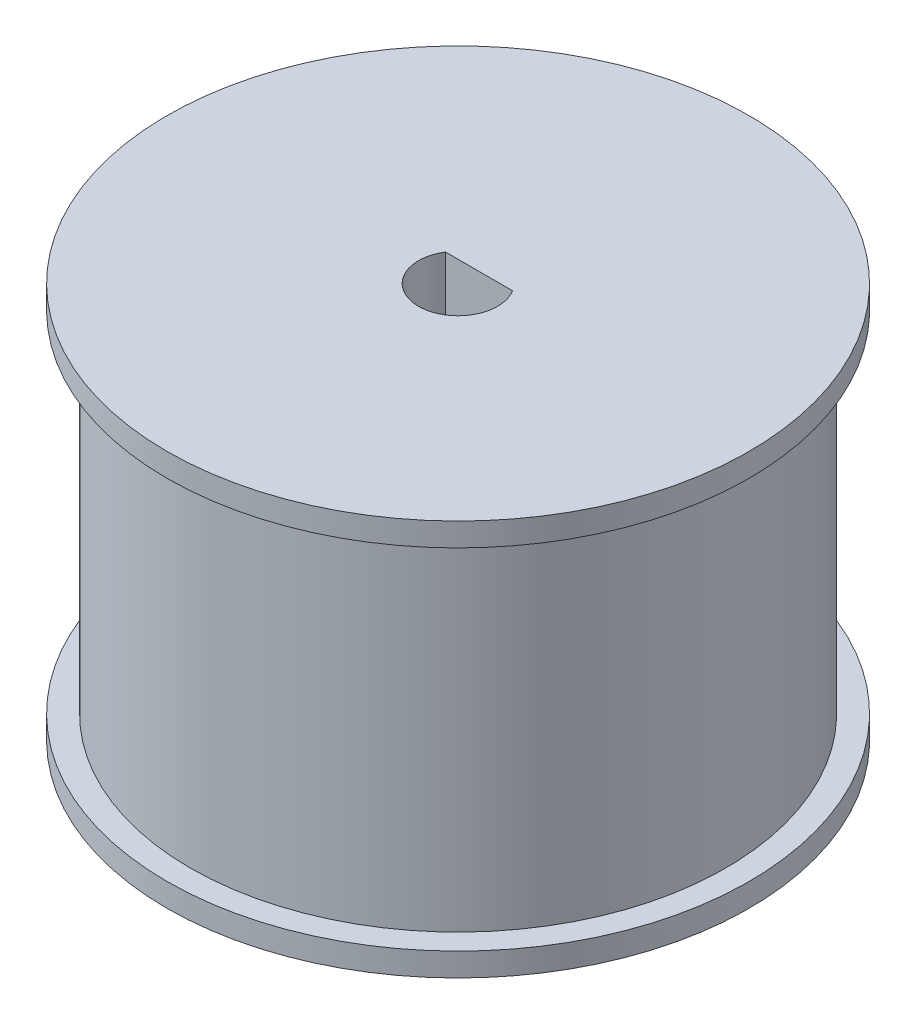
ISO-10303-21;
HEADER;
FILE_DESCRIPTION(('STEP AP214'),'2;1');
FILE_NAME('part.step','',(''),(''),'','','');
FILE_SCHEMA(('AUTOMOTIVE_DESIGN { 1 0 10303 214 1 1 1 1 }'));
ENDSEC;
DATA;
#1=APPLICATION_CONTEXT('core data for automotive mechanical design processes');
#2=APPLICATION_PROTOCOL_DEFINITION('international standard','automotive_design',2000,#1);
#3=PRODUCT_CONTEXT('',#1,'mechanical');
#4=PRODUCT('Part','Part','',(#3));
#5=PRODUCT_RELATED_PRODUCT_CATEGORY('part','',(#4));
#6=PRODUCT_DEFINITION_FORMATION('','',#4);
#7=PRODUCT_DEFINITION_CONTEXT('part definition',#1,'design');
#8=PRODUCT_DEFINITION('design','',#6,#7);
#9=PRODUCT_DEFINITION_SHAPE('','',#8);
#10=(LENGTH_UNIT() NAMED_UNIT(*) SI_UNIT(.MILLI.,.METRE.));
#11=(NAMED_UNIT(*) PLANE_ANGLE_UNIT() SI_UNIT($,.RADIAN.));
#12=(NAMED_UNIT(*) SI_UNIT($,.STERADIAN.) SOLID_ANGLE_UNIT());
#13=UNCERTAINTY_MEASURE_WITH_UNIT(LENGTH_MEASURE(1.E-05),#10,'distance_accuracy_value','');
#14=(GEOMETRIC_REPRESENTATION_CONTEXT(3) GLOBAL_UNCERTAINTY_ASSIGNED_CONTEXT((#13)) GLOBAL_UNIT_ASSIGNED_CONTEXT((#10,
#11,#12)) REPRESENTATION_CONTEXT('',''));
#15=CARTESIAN_POINT('',(0.,0.,0.));
#16=DIRECTION('',(0.,0.,1.));
#17=DIRECTION('',(1.,0.,0.));
#18=AXIS2_PLACEMENT_3D('',#15,#16,#17);
#19=CARTESIAN_POINT('',(0.,13.,-35.));
#20=DIRECTION('',(0.,0.,1.));
#21=DIRECTION('',(1.,0.,0.));
#22=AXIS2_PLACEMENT_3D('',#19,#20,#21);
#23=CYLINDRICAL_SURFACE('',#22,1.5);
#24=CARTESIAN_POINT('',(0.,13.,-3.95028417679426));
#25=DIRECTION('',(0.,0.,-1.));
#26=DIRECTION('',(-1.,0.,0.));
#27=AXIS2_PLACEMENT_3D('',#24,#25,#26);
#28=CIRCLE('',#27,1.5);
#29=CARTESIAN_POINT('',(-1.5,13.,-3.95028417679427));
#30=VERTEX_POINT('',#29);
#31=EDGE_CURVE('E163',#30,#30,#28,.F.);
#32=ORIENTED_EDGE('',*,*,#31,.T.);
#33=EDGE_LOOP('',(#32));
#34=FACE_BOUND('',#33,.T.);
#35=CARTESIAN_POINT('',(0.,13.,-5.));
#36=DIRECTION('',(0.,0.,1.));
#37=DIRECTION('',(1.,0.,0.));
#38=AXIS2_PLACEMENT_3D('',#35,#36,#37);
#39=CIRCLE('',#38,1.5);
#40=CARTESIAN_POINT('',(1.5,13.,-5.));
#41=VERTEX_POINT('',#40);
#42=EDGE_CURVE('E182',#41,#41,#39,.F.);
#43=ORIENTED_EDGE('',*,*,#42,.T.);
#44=EDGE_LOOP('',(#43));
#45=FACE_BOUND('',#44,.T.);
#46=ADVANCED_FACE('F38',(#34,#45),#23,.F.);
#47=CARTESIAN_POINT('',(0.,5.,-0.9));
#48=DIRECTION('',(0.,0.,-1.));
#49=DIRECTION('',(-1.,0.,0.));
#50=AXIS2_PLACEMENT_3D('',#47,#48,#49);
#51=PLANE('',#50);
#52=DIRECTION('',(-1.,0.,0.));
#53=VECTOR('',#52,1.);
#54=CARTESIAN_POINT('',(0.,11.,-0.9));
#55=LINE('',#54,#53);
#56=CARTESIAN_POINT('',(1.4422205101856,11.,-0.9));
#57=VERTEX_POINT('',#56);
#58=CARTESIAN_POINT('',(-1.4422205101856,11.,-0.9));
#59=VERTEX_POINT('',#58);
#60=EDGE_CURVE('E66',#57,#59,#55,.T.);
#61=ORIENTED_EDGE('',*,*,#60,.F.);
#62=DIRECTION('',(0.,1.,0.));
#63=VECTOR('',#62,1.);
#64=CARTESIAN_POINT('',(1.4422205101856,5.,-0.9));
#65=LINE('',#64,#63);
#66=CARTESIAN_POINT('',(1.4422205101856,12.5876894374382,-0.899999999999998));
#67=VERTEX_POINT('',#66);
#68=EDGE_CURVE('E195',#57,#67,#65,.T.);
#69=ORIENTED_EDGE('',*,*,#68,.T.);
#70=CARTESIAN_POINT('',(0.,13.,-0.899999999999998));
#71=DIRECTION('',(0.,0.,-1.));
#72=DIRECTION('',(-1.,0.,0.));
#73=AXIS2_PLACEMENT_3D('',#70,#71,#72);
#74=CIRCLE('',#73,1.5);
#75=CARTESIAN_POINT('',(-1.4422205101856,12.5876894374382,-0.9));
#76=VERTEX_POINT('',#75);
#77=EDGE_CURVE('E183',#67,#76,#74,.T.);
#78=ORIENTED_EDGE('',*,*,#77,.T.);
#79=DIRECTION('',(0.,1.,0.));
#80=VECTOR('',#79,1.);
#81=CARTESIAN_POINT('',(-1.4422205101856,5.,-0.9));
#82=LINE('',#81,#80);
#83=EDGE_CURVE('E199',#59,#76,#82,.T.);
#84=ORIENTED_EDGE('',*,*,#83,.F.);
#85=EDGE_LOOP('',(#61,#69,#78,#84));
#86=FACE_BOUND('',#85,.T.);
#87=ADVANCED_FACE('F275',(#86),#51,.F.);
#88=CARTESIAN_POINT('',(0.,5.,0.));
#89=DIRECTION('',(0.,1.,0.));
#90=DIRECTION('',(0.,0.,1.));
#91=AXIS2_PLACEMENT_3D('',#88,#89,#90);
#92=CYLINDRICAL_SURFACE('',#91,1.7);
#93=CARTESIAN_POINT('',(0.,11.,0.));
#94=DIRECTION('',(0.,-1.,0.));
#95=DIRECTION('',(0.,0.,-1.));
#96=AXIS2_PLACEMENT_3D('',#93,#94,#95);
#97=CIRCLE('',#96,1.7);
#98=EDGE_CURVE('E176',#59,#57,#97,.F.);
#99=ORIENTED_EDGE('',*,*,#98,.F.);
#100=ORIENTED_EDGE('',*,*,#83,.T.);
#101=CARTESIAN_POINT('',(-1.4422205101856,12.5876894374382,-0.9));
#102=CARTESIAN_POINT('',(-1.45436177751899,12.630073109417,-0.880553066630265));
#103=CARTESIAN_POINT('',(-1.46488633625352,12.6740473945262,-0.862788449725907));
#104=CARTESIAN_POINT('',(-1.48216237043669,12.7647897028884,-0.832765724447385));
#105=CARTESIAN_POINT('',(-1.488891594914,12.8115724581733,-0.820540170551742));
#106=CARTESIAN_POINT('',(-1.49718270251927,12.8996068342855,-0.805301503870675));
#107=CARTESIAN_POINT('',(-1.49938590770335,12.9405858159016,-0.801150567547422));
#108=CARTESIAN_POINT('',(-1.5003878120094,13.0225676804662,-0.799273633707348));
#109=CARTESIAN_POINT('',(-1.49920039765459,13.0635697802693,-0.801521429611797));
#110=CARTESIAN_POINT('',(-1.49358336010865,13.144385437941,-0.811936163517475));
#111=CARTESIAN_POINT('',(-1.48916607228775,13.1842029196134,-0.820080580281892));
#112=CARTESIAN_POINT('',(-1.47743496351625,13.2622030982032,-0.84102696383754));
#113=CARTESIAN_POINT('',(-1.47011319739655,13.3003809898814,-0.8538416983515));
#114=CARTESIAN_POINT('',(-1.45565704173986,13.3629577008494,-0.878178541069001));
#115=CARTESIAN_POINT('',(-1.44920835099617,13.387866075984,-0.888808340240248));
#116=CARTESIAN_POINT('',(-1.4422205101864,13.412310562561,-0.900000000002466));
#117=B_SPLINE_CURVE_WITH_KNOTS('',3,(#101,#102,#103,#104,#105,#106,#107,#108,#109,#110,#111,
#112,#113,#114,#115,#116),.UNSPECIFIED.,.F.,.F.,(4,2,2,2,2,2,2,4),(0.,0.144979502686602,
0.290800371916249,0.413921670619366,0.536539441426645,0.658691346529454,0.781179726868842,
0.864583342636484),.UNSPECIFIED.);
#118=CARTESIAN_POINT('',(-1.4422205101856,13.4123105625618,-0.9));
#119=VERTEX_POINT('',#118);
#120=EDGE_CURVE('E213',#76,#119,#117,.T.);
#121=ORIENTED_EDGE('',*,*,#120,.T.);
#122=CARTESIAN_POINT('',(-1.4422205101856,17.,-0.9));
#123=VERTEX_POINT('',#122);
#124=EDGE_CURVE('E194',#119,#123,#82,.T.);
#125=ORIENTED_EDGE('',*,*,#124,.T.);
#126=CARTESIAN_POINT('',(0.,17.,0.));
#127=DIRECTION('',(0.,1.,0.));
#128=DIRECTION('',(0.,0.,1.));
#129=AXIS2_PLACEMENT_3D('',#126,#127,#128);
#130=CIRCLE('',#129,1.7);
#131=CARTESIAN_POINT('',(1.4422205101856,17.,-0.9));
#132=VERTEX_POINT('',#131);
#133=EDGE_CURVE('E191',#123,#132,#130,.T.);
#134=ORIENTED_EDGE('',*,*,#133,.T.);
#135=CARTESIAN_POINT('',(1.4422205101856,13.4123105625618,-0.899999999999998));
#136=VERTEX_POINT('',#135);
#137=EDGE_CURVE('E198',#136,#132,#65,.T.);
#138=ORIENTED_EDGE('',*,*,#137,.F.);
#139=CARTESIAN_POINT('',(1.4422205101856,13.4123105625618,-0.9));
#140=CARTESIAN_POINT('',(1.45436177751899,13.3699268905831,-0.880553066630265));
#141=CARTESIAN_POINT('',(1.46488633625352,13.3259526054738,-0.862788449725906));
#142=CARTESIAN_POINT('',(1.48216237043669,13.2352102971116,-0.832765724447384));
#143=CARTESIAN_POINT('',(1.488891594914,13.1884275418267,-0.82054017055174));
#144=CARTESIAN_POINT('',(1.49718270251927,13.1003931657145,-0.805301503870673));
#145=CARTESIAN_POINT('',(1.49938590770335,13.0594141840984,-0.801150567547419));
#146=CARTESIAN_POINT('',(1.5003878120094,12.9774323195338,-0.799273633707345));
#147=CARTESIAN_POINT('',(1.49920039765459,12.9364302197307,-0.801521429611793));
#148=CARTESIAN_POINT('',(1.49358336010865,12.855614562059,-0.811936163517472));
#149=CARTESIAN_POINT('',(1.48916607228776,12.8157970803866,-0.820080580281888));
#150=CARTESIAN_POINT('',(1.47743496351625,12.7377969017968,-0.841026963837536));
#151=CARTESIAN_POINT('',(1.47011319739656,12.6996190101187,-0.853841698351496));
#152=CARTESIAN_POINT('',(1.45565704173986,12.6370422991506,-0.878178541068998));
#153=CARTESIAN_POINT('',(1.44920835099617,12.612133924016,-0.888808340240246));
#154=CARTESIAN_POINT('',(1.4422205101864,12.587689437439,-0.900000000002466));
#155=B_SPLINE_CURVE_WITH_KNOTS('',3,(#139,#140,#141,#142,#143,#144,#145,#146,#147,#148,#149,
#150,#151,#152,#153,#154),.UNSPECIFIED.,.F.,.F.,(4,2,2,2,2,2,2,4),(0.,0.144979502686602,
0.29080037191625,0.413921670619368,0.536539441426647,0.658691346529457,0.781179726868844,
0.864583342636496),.UNSPECIFIED.);
#156=EDGE_CURVE('E227',#136,#67,#155,.T.);
#157=ORIENTED_EDGE('',*,*,#156,.T.);
#158=ORIENTED_EDGE('',*,*,#68,.F.);
#159=EDGE_LOOP('',(#99,#100,#121,#125,#134,#138,#157,#158));
#160=FACE_BOUND('',#159,.T.);
#161=ADVANCED_FACE('F233',(#160),#92,.F.);
#162=CARTESIAN_POINT('',(0.,13.,-40.));
#163=DIRECTION('',(0.,0.,1.));
#164=DIRECTION('',(1.,0.,0.));
#165=AXIS2_PLACEMENT_3D('',#162,#163,#164);
#166=CYLINDRICAL_SURFACE('',#165,2.75);
#167=CARTESIAN_POINT('',(0.,15.75,-11.5));
#168=CARTESIAN_POINT('',(-0.152150137393641,15.7499953667666,-11.4999973072806));
#169=CARTESIAN_POINT('',(-0.30435347662172,15.7373303653805,-11.4969501742547));
#170=CARTESIAN_POINT('',(-0.604411999997974,15.6870723979661,-11.4850894516404));
#171=CARTESIAN_POINT('',(-0.752264428415971,15.6494639739615,-11.4762722862838));
#172=CARTESIAN_POINT('',(-1.03924348427125,15.550584048094,-11.453849811082));
#173=CARTESIAN_POINT('',(-1.17837989165534,15.4893396408975,-11.4402499853288));
#174=CARTESIAN_POINT('',(-1.4444017311079,15.3450182853979,-11.409717554275));
#175=CARTESIAN_POINT('',(-1.57128700852892,15.2619410615457,-11.392784906912));
#176=CARTESIAN_POINT('',(-1.81161247540619,15.0746471876678,-11.3570721461684));
#177=CARTESIAN_POINT('',(-1.92478718841928,14.9700949291396,-11.3382655022112));
#178=CARTESIAN_POINT('',(-2.13217347436031,14.7435380873747,-11.3011044137846));
#179=CARTESIAN_POINT('',(-2.22638307821502,14.6215316941907,-11.2827500164437));
#180=CARTESIAN_POINT('',(-2.39438535742319,14.3615042059649,-11.248306351564));
#181=CARTESIAN_POINT('',(-2.46788626110228,14.2232897171924,-11.2322508849504));
#182=CARTESIAN_POINT('',(-2.59051014428539,13.9360217028249,-11.2046077596331));
#183=CARTESIAN_POINT('',(-2.63963665959893,13.7869697529378,-11.1930194529665));
#184=CARTESIAN_POINT('',(-2.71122176745634,13.4851632754005,-11.175894558722));
#185=CARTESIAN_POINT('',(-2.73415511956391,13.3325275978065,-11.1702503839907));
#186=CARTESIAN_POINT('',(-2.7541808102791,13.0254789989168,-11.165330394639));
#187=CARTESIAN_POINT('',(-2.7512769753726,12.8710663441742,-11.1660536370043));
#188=CARTESIAN_POINT('',(-2.72009068709902,12.5684454248356,-11.1736897971772));
#189=CARTESIAN_POINT('',(-2.69236872411047,12.4201754169814,-11.1804660078395));
#190=CARTESIAN_POINT('',(-2.61322499203855,12.1304539196722,-11.1992273627769));
#191=CARTESIAN_POINT('',(-2.56180166325083,11.9890028796264,-11.2112128498534));
#192=CARTESIAN_POINT('',(-2.43622404489012,11.7154054669088,-11.2391710882947));
#193=CARTESIAN_POINT('',(-2.36186199503227,11.5833583059536,-11.2551800246116));
#194=CARTESIAN_POINT('',(-2.19266336524233,11.3334130704949,-11.289360306577));
#195=CARTESIAN_POINT('',(-2.09782348550765,11.2155172811164,-11.3075320005208));
#196=CARTESIAN_POINT('',(-1.88743498264532,10.9940038441503,-11.3445699137091));
#197=CARTESIAN_POINT('',(-1.77141202094247,10.8908371555628,-11.3634419061811));
#198=CARTESIAN_POINT('',(-1.52348962342984,10.7053436889855,-11.3993264482496));
#199=CARTESIAN_POINT('',(-1.39158978049712,10.6230174455649,-11.4163389501427));
#200=CARTESIAN_POINT('',(-1.11504811558962,10.4813961104277,-11.4466609946813));
#201=CARTESIAN_POINT('',(-0.970370132709455,10.4221691267049,-11.4599595545501));
#202=CARTESIAN_POINT('',(-0.672724089728664,10.3289984907855,-11.4812749673935));
#203=CARTESIAN_POINT('',(-0.519757481898064,10.2950504246769,-11.4892927424093));
#204=CARTESIAN_POINT('',(-0.213736454280069,10.2540780825633,-11.4990086271386));
#205=CARTESIAN_POINT('',(-0.060768808303682,10.2464390300023,-11.5008510124682));
#206=CARTESIAN_POINT('',(0.244258052794933,10.2566225768779,-11.4984170562747));
#207=CARTESIAN_POINT('',(0.3963173412883,10.2744430911516,-11.4941412158401));
#208=CARTESIAN_POINT('',(0.693110684963743,10.3345319070794,-11.4800432103531));
#209=CARTESIAN_POINT('',(0.837915583856997,10.3764694901909,-11.4702961152744));
#210=CARTESIAN_POINT('',(1.11843081185993,10.4832281080891,-11.4463508643137));
#211=CARTESIAN_POINT('',(1.25414026866138,10.5480513340221,-11.4321522822462));
#212=CARTESIAN_POINT('',(1.51509332410053,10.6999647141385,-11.4005293509386));
#213=CARTESIAN_POINT('',(1.64012678231909,10.7874053068967,-11.3830555486337));
#214=CARTESIAN_POINT('',(1.87396502799464,10.9816185940386,-11.3469061486686));
#215=CARTESIAN_POINT('',(1.98276726120669,11.0883943252775,-11.3282303625174));
#216=CARTESIAN_POINT('',(2.18355145849863,11.3210904471819,-11.2912699501164));
#217=CARTESIAN_POINT('',(2.27510400205519,11.4473848127253,-11.2730033465688));
#218=CARTESIAN_POINT('',(2.43570952139137,11.7139119714199,-11.2393984791076));
#219=CARTESIAN_POINT('',(2.50476350453384,11.8541441401453,-11.2240600840976));
#220=CARTESIAN_POINT('',(2.61790953870323,12.1438014601715,-11.1982105578336));
#221=CARTESIAN_POINT('',(2.66214868275643,12.2931664920144,-11.1876710522397));
#222=CARTESIAN_POINT('',(2.72481534145168,12.5975010033235,-11.1725753371484));
#223=CARTESIAN_POINT('',(2.74324793608967,12.7524693736147,-11.1680179500873));
#224=CARTESIAN_POINT('',(2.75353015836332,13.059257097452,-11.165486720759));
#225=CARTESIAN_POINT('',(2.74606398479213,13.2110525053724,-11.1673434243873));
#226=CARTESIAN_POINT('',(2.70631336951603,13.5111532729751,-11.1770424759027));
#227=CARTESIAN_POINT('',(2.6740293470396,13.6594586915674,-11.1848847226807));
#228=CARTESIAN_POINT('',(2.5859181040857,13.9476982129089,-11.2055809507118));
#229=CARTESIAN_POINT('',(2.53020885109141,14.087670304156,-11.218409795736));
#230=CARTESIAN_POINT('',(2.3969238584258,14.3563761898035,-11.2476393291241));
#231=CARTESIAN_POINT('',(2.31934534816979,14.4851085575514,-11.2640404699972));
#232=CARTESIAN_POINT('',(2.14233424442535,14.7310114762006,-11.2990581360084));
#233=CARTESIAN_POINT('',(2.04242216286876,14.8478307113226,-11.3177183577312));
#234=CARTESIAN_POINT('',(1.82452821103229,15.0632682144756,-11.3548795259439));
#235=CARTESIAN_POINT('',(1.70654210646362,15.1618822055072,-11.3733804340351));
#236=CARTESIAN_POINT('',(1.4535456151233,15.3396566146748,-11.408495019374));
#237=CARTESIAN_POINT('',(1.31829065456227,15.418476442572,-11.4250733161788));
#238=CARTESIAN_POINT('',(1.03607182880868,15.5521349227371,-11.4541088679914));
#239=CARTESIAN_POINT('',(0.889116982123139,15.6069918385134,-11.466569259721));
#240=CARTESIAN_POINT('',(0.618555243720711,15.6824252278481,-11.4839830836764));
#241=CARTESIAN_POINT('',(0.496305381443031,15.7077133951435,-11.4899496708808));
#242=CARTESIAN_POINT('',(0.249382158346012,15.7415021532889,-11.4979591094661));
#243=CARTESIAN_POINT('',(0.124708950103264,15.750003797602,-11.5000022070714));
#244=CARTESIAN_POINT('',(0.,15.75,-11.5));
#245=B_SPLINE_CURVE_WITH_KNOTS('',3,(#167,#168,#169,#170,#171,#172,#173,#174,#175,#176,#177,
#178,#179,#180,#181,#182,#183,#184,#185,#186,#187,#188,#189,#190,#191,#192,#193,#194,#195,#196,
#197,#198,#199,#200,#201,#202,#203,#204,#205,#206,#207,#208,#209,#210,#211,#212,#213,#214,#215,
#216,#217,#218,#219,#220,#221,#222,#223,#224,#225,#226,#227,#228,#229,#230,#231,#232,#233,#234,
#235,#236,#237,#238,#239,#240,#241,#242,#243,#244),.UNSPECIFIED.,.T.,.F.,(4,2,2,2,2,2,2,2,2,2,2,
2,2,2,2,2,2,2,2,2,2,2,2,2,2,2,2,2,2,2,2,2,2,2,2,2,2,2,4),(0.,0.455993595471823,
0.912270044372461,1.36802499551497,1.8237856989536,2.28730049559834,2.7508633923817,
3.22066365871592,3.69039575471266,4.15147151398919,4.61247898910951,5.06333064808744,
5.51421198028021,5.96930328192772,6.42446797190169,6.89146760752913,7.35847922074732,
7.82685758820393,8.29515415366075,8.7524306748546,9.20966974680974,9.66078331319664,
10.1119400823906,10.5705562352996,11.029244482896,11.498166182106,11.9670668826732,
12.4331579215448,12.8991571979099,13.3529404182941,13.8067159734422,14.2582332151565,
14.7098076846666,15.1722118545258,15.6347245201881,16.1047209478865,16.5743585367107,
16.9481344175447,17.3218868407711),.UNSPECIFIED.);
#246=CARTESIAN_POINT('',(0.,15.75,-11.5));
#247=VERTEX_POINT('',#246);
#248=EDGE_CURVE('E187',#247,#247,#245,.T.);
#249=ORIENTED_EDGE('',*,*,#248,.F.);
#250=EDGE_LOOP('',(#249));
#251=FACE_BOUND('',#250,.T.);
#252=DIRECTION('',(0.,0.,1.));
#253=VECTOR('',#252,1.);
#254=CARTESIAN_POINT('',(1.88745860881768,11.,-40.));
#255=LINE('',#254,#253);
#256=CARTESIAN_POINT('',(1.88745860881768,11.,-5.));
#257=VERTEX_POINT('',#256);
#258=CARTESIAN_POINT('',(1.88745860881768,11.,-9.31061222476804));
#259=VERTEX_POINT('',#258);
#260=EDGE_CURVE('E174',#257,#259,#255,.F.);
#261=ORIENTED_EDGE('',*,*,#260,.F.);
#262=CARTESIAN_POINT('',(0.,13.,-5.));
#263=DIRECTION('',(0.,0.,1.));
#264=DIRECTION('',(1.,0.,0.));
#265=AXIS2_PLACEMENT_3D('',#262,#263,#264);
#266=CIRCLE('',#265,2.75);
#267=CARTESIAN_POINT('',(-1.88745860881768,11.,-5.));
#268=VERTEX_POINT('',#267);
#269=EDGE_CURVE('E179',#257,#268,#266,.T.);
#270=ORIENTED_EDGE('',*,*,#269,.T.);
#271=DIRECTION('',(0.,0.,1.));
#272=VECTOR('',#271,1.);
#273=CARTESIAN_POINT('',(-1.88745860881768,11.,-40.));
#274=LINE('',#273,#272);
#275=CARTESIAN_POINT('',(-1.88745860881768,11.,-9.31061222476804));
#276=VERTEX_POINT('',#275);
#277=EDGE_CURVE('E170',#276,#268,#274,.T.);
#278=ORIENTED_EDGE('',*,*,#277,.F.);
#279=CARTESIAN_POINT('',(-1.88745860881768,11.,-9.31061222476804));
#280=CARTESIAN_POINT('',(-1.83178795305855,10.9474656464085,-9.32189818303096));
#281=CARTESIAN_POINT('',(-1.77394322034771,10.8972692112689,-9.333103644349));
#282=CARTESIAN_POINT('',(-1.65421266583406,10.8018300432843,-9.35506767400262));
#283=CARTESIAN_POINT('',(-1.59232639283206,10.7565878650489,-9.36582619222118));
#284=CARTESIAN_POINT('',(-1.40109694675739,10.6287342002644,-9.39699670165952));
#285=CARTESIAN_POINT('',(-1.26617297015984,10.5539859851126,-9.41630579152848));
#286=CARTESIAN_POINT('',(-0.985055687395734,10.4278500439487,-9.44985358377066));
#287=CARTESIAN_POINT('',(-0.838847290992057,10.3764942556444,-9.46408534835712));
#288=CARTESIAN_POINT('',(-0.539499781019372,10.2990189699848,-9.48585289604696));
#289=CARTESIAN_POINT('',(-0.386366862204461,10.2728773656898,-9.4933945443503));
#290=CARTESIAN_POINT('',(-0.0817514720553655,10.2470787379151,-9.50083828912891));
#291=CARTESIAN_POINT('',(0.0696694557969158,10.2467470704253,-9.5009349878629));
#292=CARTESIAN_POINT('',(0.370400942812845,10.2708868306808,-9.49396796118731));
#293=CARTESIAN_POINT('',(0.519710866673811,10.29536557048,-9.4869021248553));
#294=CARTESIAN_POINT('',(0.80995843756229,10.3677830282124,-9.46651398802956));
#295=CARTESIAN_POINT('',(0.950979791214672,10.4154120903031,-9.45327435981206));
#296=CARTESIAN_POINT('',(1.22302856805415,10.5324905555022,-9.42193922016526));
#297=CARTESIAN_POINT('',(1.35406074728496,10.6019294928401,-9.40384603838721));
#298=CARTESIAN_POINT('',(1.55160714982607,10.7278720531804,-9.37272814307599));
#299=CARTESIAN_POINT('',(1.62247528080333,10.7779329015417,-9.3606831591874));
#300=CARTESIAN_POINT('',(1.75896964627971,10.884345316774,-9.33599649977708));
#301=CARTESIAN_POINT('',(1.82460636815079,10.9406837257124,-9.32335610322262));
#302=CARTESIAN_POINT('',(1.88745860881768,11.,-9.31061222476804));
#303=B_SPLINE_CURVE_WITH_KNOTS('',3,(#279,#280,#281,#282,#283,#284,#285,#286,#287,#288,#289,
#290,#291,#292,#293,#294,#295,#296,#297,#298,#299,#300,#301,#302),.UNSPECIFIED.,.F.,.F.,(4,2,2,
2,2,2,2,2,2,2,2,4),(0.,0.231979818273399,0.463985579287245,0.927955168643173,1.39255633135028,
1.85674977625863,2.30880551547643,2.76099452205138,3.20729495287683,3.65338154662476,
3.91582881397124,4.1777359806755),.UNSPECIFIED.);
#304=EDGE_CURVE('E12',#276,#259,#303,.T.);
#305=ORIENTED_EDGE('',*,*,#304,.T.);
#306=EDGE_LOOP('',(#261,#270,#278,#305));
#307=FACE_BOUND('',#306,.T.);
#308=ADVANCED_FACE('F242',(#251,#307),#166,.F.);
#309=CARTESIAN_POINT('',(0.,13.,-5.));
#310=DIRECTION('',(0.,0.,1.));
#311=DIRECTION('',(1.,0.,0.));
#312=AXIS2_PLACEMENT_3D('',#309,#310,#311);
#313=PLANE('',#312);
#314=ORIENTED_EDGE('',*,*,#42,.F.);
#315=EDGE_LOOP('',(#314));
#316=FACE_BOUND('',#315,.T.);
#317=DIRECTION('',(1.,0.,0.));
#318=VECTOR('',#317,1.);
#319=CARTESIAN_POINT('',(0.,11.,-5.));
#320=LINE('',#319,#318);
#321=EDGE_CURVE('E52',#268,#257,#320,.T.);
#322=ORIENTED_EDGE('',*,*,#321,.F.);
#323=ORIENTED_EDGE('',*,*,#269,.F.);
#324=EDGE_LOOP('',(#322,#323));
#325=FACE_BOUND('',#324,.T.);
#326=ADVANCED_FACE('F247',(#316,#325),#313,.F.);
#327=ORIENTED_EDGE('',*,*,#124,.F.);
#328=EDGE_CURVE('E186',#119,#136,#74,.T.);
#329=ORIENTED_EDGE('',*,*,#328,.T.);
#330=ORIENTED_EDGE('',*,*,#137,.T.);
#331=DIRECTION('',(-1.,0.,0.));
#332=VECTOR('',#331,1.);
#333=CARTESIAN_POINT('',(0.,17.,-0.9));
#334=LINE('',#333,#332);
#335=EDGE_CURVE('E188',#132,#123,#334,.T.);
#336=ORIENTED_EDGE('',*,*,#335,.T.);
#337=EDGE_LOOP('',(#327,#329,#330,#336));
#338=FACE_BOUND('',#337,.T.);
#339=ADVANCED_FACE('F282',(#338),#51,.F.);
#340=CARTESIAN_POINT('',(0.,1.,0.));
#341=DIRECTION('',(0.,-1.,0.));
#342=DIRECTION('',(0.,0.,-1.));
#343=AXIS2_PLACEMENT_3D('',#340,#341,#342);
#344=CYLINDRICAL_SURFACE('',#343,12.5);
#345=CARTESIAN_POINT('',(0.,1.,0.));
#346=DIRECTION('',(0.,1.,0.));
#347=DIRECTION('',(0.,0.,1.));
#348=AXIS2_PLACEMENT_3D('',#345,#346,#347);
#349=CIRCLE('',#348,12.5);
#350=CARTESIAN_POINT('',(0.,1.,12.5));
#351=VERTEX_POINT('',#350);
#352=EDGE_CURVE('E214',#351,#351,#349,.T.);
#353=ORIENTED_EDGE('',*,*,#352,.F.);
#354=EDGE_LOOP('',(#353));
#355=FACE_BOUND('',#354,.T.);
#356=CARTESIAN_POINT('',(0.,0.,0.));
#357=DIRECTION('',(0.,1.,0.));
#358=DIRECTION('',(0.,0.,1.));
#359=AXIS2_PLACEMENT_3D('',#356,#357,#358);
#360=CIRCLE('',#359,12.5);
#361=CARTESIAN_POINT('',(0.,0.,12.5));
#362=VERTEX_POINT('',#361);
#363=EDGE_CURVE('E209',#362,#362,#360,.T.);
#364=ORIENTED_EDGE('',*,*,#363,.T.);
#365=EDGE_LOOP('',(#364));
#366=FACE_BOUND('',#365,.T.);
#367=ADVANCED_FACE('F40',(#355,#366),#344,.T.);
#368=CARTESIAN_POINT('',(0.,1.,0.));
#369=DIRECTION('',(0.,1.,0.));
#370=DIRECTION('',(0.,0.,1.));
#371=AXIS2_PLACEMENT_3D('',#368,#369,#370);
#372=PLANE('',#371);
#373=CARTESIAN_POINT('',(0.,1.,0.));
#374=DIRECTION('',(0.,1.,0.));
#375=DIRECTION('',(0.,0.,1.));
#376=AXIS2_PLACEMENT_3D('',#373,#374,#375);
#377=CIRCLE('',#376,11.5);
#378=CARTESIAN_POINT('',(0.,1.,11.5));
#379=VERTEX_POINT('',#378);
#380=EDGE_CURVE('E210',#379,#379,#377,.T.);
#381=ORIENTED_EDGE('',*,*,#380,.F.);
#382=EDGE_LOOP('',(#381));
#383=FACE_BOUND('',#382,.T.);
#384=ORIENTED_EDGE('',*,*,#352,.T.);
#385=EDGE_LOOP('',(#384));
#386=FACE_BOUND('',#385,.T.);
#387=ADVANCED_FACE('F265',(#383,#386),#372,.T.);
#388=CARTESIAN_POINT('',(0.,0.,0.));
#389=DIRECTION('',(0.,1.,0.));
#390=DIRECTION('',(0.,0.,1.));
#391=AXIS2_PLACEMENT_3D('',#388,#389,#390);
#392=PLANE('',#391);
#393=CARTESIAN_POINT('',(0.,0.,0.));
#394=DIRECTION('',(0.,-1.,0.));
#395=DIRECTION('',(0.,0.,-1.));
#396=AXIS2_PLACEMENT_3D('',#393,#394,#395);
#397=CIRCLE('',#396,9.5);
#398=CARTESIAN_POINT('',(0.,0.,-9.5));
#399=VERTEX_POINT('',#398);
#400=EDGE_CURVE('E166',#399,#399,#397,.T.);
#401=ORIENTED_EDGE('',*,*,#400,.F.);
#402=EDGE_LOOP('',(#401));
#403=FACE_BOUND('',#402,.T.);
#404=ORIENTED_EDGE('',*,*,#363,.F.);
#405=EDGE_LOOP('',(#404));
#406=FACE_BOUND('',#405,.T.);
#407=ADVANCED_FACE('F262',(#403,#406),#392,.F.);
#408=CARTESIAN_POINT('',(0.,16.,0.));
#409=DIRECTION('',(0.,-1.,0.));
#410=DIRECTION('',(0.,0.,-1.));
#411=AXIS2_PLACEMENT_3D('',#408,#409,#410);
#412=CYLINDRICAL_SURFACE('',#411,11.5);
#413=ORIENTED_EDGE('',*,*,#248,.T.);
#414=EDGE_LOOP('',(#413));
#415=FACE_BOUND('',#414,.T.);
#416=CARTESIAN_POINT('',(0.,16.,0.));
#417=DIRECTION('',(0.,1.,0.));
#418=DIRECTION('',(0.,0.,1.));
#419=AXIS2_PLACEMENT_3D('',#416,#417,#418);
#420=CIRCLE('',#419,11.5);
#421=CARTESIAN_POINT('',(0.,16.,11.5));
#422=VERTEX_POINT('',#421);
#423=EDGE_CURVE('E204',#422,#422,#420,.T.);
#424=ORIENTED_EDGE('',*,*,#423,.F.);
#425=EDGE_LOOP('',(#424));
#426=FACE_BOUND('',#425,.T.);
#427=ORIENTED_EDGE('',*,*,#380,.T.);
#428=EDGE_LOOP('',(#427));
#429=FACE_BOUND('',#428,.T.);
#430=ADVANCED_FACE('F256',(#415,#426,#429),#412,.T.);
#431=CARTESIAN_POINT('',(0.,17.,0.));
#432=DIRECTION('',(0.,-1.,0.));
#433=DIRECTION('',(0.,0.,-1.));
#434=AXIS2_PLACEMENT_3D('',#431,#432,#433);
#435=CYLINDRICAL_SURFACE('',#434,12.5);
#436=CARTESIAN_POINT('',(0.,17.,0.));
#437=DIRECTION('',(0.,1.,0.));
#438=DIRECTION('',(0.,0.,1.));
#439=AXIS2_PLACEMENT_3D('',#436,#437,#438);
#440=CIRCLE('',#439,12.5);
#441=CARTESIAN_POINT('',(0.,17.,12.5));
#442=VERTEX_POINT('',#441);
#443=EDGE_CURVE('E201',#442,#442,#440,.T.);
#444=ORIENTED_EDGE('',*,*,#443,.F.);
#445=EDGE_LOOP('',(#444));
#446=FACE_BOUND('',#445,.T.);
#447=CARTESIAN_POINT('',(0.,16.,0.));
#448=DIRECTION('',(0.,1.,0.));
#449=DIRECTION('',(0.,0.,1.));
#450=AXIS2_PLACEMENT_3D('',#447,#448,#449);
#451=CIRCLE('',#450,12.5);
#452=CARTESIAN_POINT('',(0.,16.,12.5));
#453=VERTEX_POINT('',#452);
#454=EDGE_CURVE('E197',#453,#453,#451,.T.);
#455=ORIENTED_EDGE('',*,*,#454,.T.);
#456=EDGE_LOOP('',(#455));
#457=FACE_BOUND('',#456,.T.);
#458=ADVANCED_FACE('F261',(#446,#457),#435,.T.);
#459=CARTESIAN_POINT('',(0.,17.,0.));
#460=DIRECTION('',(0.,1.,0.));
#461=DIRECTION('',(0.,0.,1.));
#462=AXIS2_PLACEMENT_3D('',#459,#460,#461);
#463=PLANE('',#462);
#464=ORIENTED_EDGE('',*,*,#335,.F.);
#465=ORIENTED_EDGE('',*,*,#133,.F.);
#466=EDGE_LOOP('',(#464,#465));
#467=FACE_BOUND('',#466,.T.);
#468=ORIENTED_EDGE('',*,*,#443,.T.);
#469=EDGE_LOOP('',(#468));
#470=FACE_BOUND('',#469,.T.);
#471=ADVANCED_FACE('F363',(#467,#470),#463,.T.);
#472=CARTESIAN_POINT('',(0.,16.,0.));
#473=DIRECTION('',(0.,1.,0.));
#474=DIRECTION('',(0.,0.,1.));
#475=AXIS2_PLACEMENT_3D('',#472,#473,#474);
#476=PLANE('',#475);
#477=ORIENTED_EDGE('',*,*,#423,.T.);
#478=EDGE_LOOP('',(#477));
#479=FACE_BOUND('',#478,.T.);
#480=ORIENTED_EDGE('',*,*,#454,.F.);
#481=EDGE_LOOP('',(#480));
#482=FACE_BOUND('',#481,.T.);
#483=ADVANCED_FACE('F240',(#479,#482),#476,.F.);
#484=CARTESIAN_POINT('',(0.,13.,-1.45028417679426));
#485=DIRECTION('',(0.,0.,1.));
#486=DIRECTION('',(1.,0.,0.));
#487=AXIS2_PLACEMENT_3D('',#484,#485,#486);
#488=CIRCLE('',#487,1.5);
#489=CARTESIAN_POINT('',(1.5,13.,-1.45028417679426));
#490=VERTEX_POINT('',#489);
#491=EDGE_CURVE('E157',#490,#490,#488,.F.);
#492=ORIENTED_EDGE('',*,*,#491,.T.);
#493=EDGE_LOOP('',(#492));
#494=FACE_BOUND('',#493,.T.);
#495=ORIENTED_EDGE('',*,*,#328,.F.);
#496=ORIENTED_EDGE('',*,*,#120,.F.);
#497=ORIENTED_EDGE('',*,*,#77,.F.);
#498=ORIENTED_EDGE('',*,*,#156,.F.);
#499=EDGE_LOOP('',(#495,#496,#497,#498));
#500=FACE_BOUND('',#499,.T.);
#501=ADVANCED_FACE('F236',(#494,#500),#23,.F.);
#502=CARTESIAN_POINT('',(0.,11.,0.));
#503=DIRECTION('',(0.,-1.,0.));
#504=DIRECTION('',(0.,0.,-1.));
#505=AXIS2_PLACEMENT_3D('',#502,#503,#504);
#506=CYLINDRICAL_SURFACE('',#505,9.5);
#507=ORIENTED_EDGE('',*,*,#400,.T.);
#508=EDGE_LOOP('',(#507));
#509=FACE_BOUND('',#508,.T.);
#510=CARTESIAN_POINT('',(0.,11.,0.));
#511=DIRECTION('',(0.,-1.,0.));
#512=DIRECTION('',(0.,0.,-1.));
#513=AXIS2_PLACEMENT_3D('',#510,#511,#512);
#514=CIRCLE('',#513,9.5);
#515=EDGE_CURVE('E167',#259,#276,#514,.T.);
#516=ORIENTED_EDGE('',*,*,#515,.F.);
#517=ORIENTED_EDGE('',*,*,#304,.F.);
#518=EDGE_LOOP('',(#516,#517));
#519=FACE_BOUND('',#518,.T.);
#520=ADVANCED_FACE('F239',(#509,#519),#506,.F.);
#521=CARTESIAN_POINT('',(0.,11.,0.));
#522=DIRECTION('',(0.,-1.,0.));
#523=DIRECTION('',(0.,0.,-1.));
#524=AXIS2_PLACEMENT_3D('',#521,#522,#523);
#525=PLANE('',#524);
#526=DIRECTION('',(0.,0.,1.));
#527=VECTOR('',#526,1.);
#528=CARTESIAN_POINT('',(2.9,11.,-1.45028417679426));
#529=LINE('',#528,#527);
#530=CARTESIAN_POINT('',(2.9,11.,-3.95028417679426));
#531=VERTEX_POINT('',#530);
#532=CARTESIAN_POINT('',(2.9,11.,-1.45028417679426));
#533=VERTEX_POINT('',#532);
#534=EDGE_CURVE('E59',#531,#533,#529,.T.);
#535=ORIENTED_EDGE('',*,*,#534,.F.);
#536=DIRECTION('',(1.,0.,0.));
#537=VECTOR('',#536,1.);
#538=CARTESIAN_POINT('',(-2.9,11.,-3.95028417679426));
#539=LINE('',#538,#537);
#540=CARTESIAN_POINT('',(-2.9,11.,-3.95028417679426));
#541=VERTEX_POINT('',#540);
#542=EDGE_CURVE('E142',#541,#531,#539,.T.);
#543=ORIENTED_EDGE('',*,*,#542,.F.);
#544=DIRECTION('',(0.,0.,-1.));
#545=VECTOR('',#544,1.);
#546=CARTESIAN_POINT('',(-2.9,11.,-1.45028417679426));
#547=LINE('',#546,#545);
#548=CARTESIAN_POINT('',(-2.9,11.,-1.45028417679426));
#549=VERTEX_POINT('',#548);
#550=EDGE_CURVE('E145',#549,#541,#547,.T.);
#551=ORIENTED_EDGE('',*,*,#550,.F.);
#552=DIRECTION('',(-1.,0.,0.));
#553=VECTOR('',#552,1.);
#554=CARTESIAN_POINT('',(-2.9,11.,-1.45028417679426));
#555=LINE('',#554,#553);
#556=EDGE_CURVE('E151',#533,#549,#555,.T.);
#557=ORIENTED_EDGE('',*,*,#556,.F.);
#558=EDGE_LOOP('',(#535,#543,#551,#557));
#559=FACE_BOUND('',#558,.T.);
#560=ORIENTED_EDGE('',*,*,#260,.T.);
#561=ORIENTED_EDGE('',*,*,#515,.T.);
#562=ORIENTED_EDGE('',*,*,#277,.T.);
#563=ORIENTED_EDGE('',*,*,#321,.T.);
#564=EDGE_LOOP('',(#560,#561,#562,#563));
#565=FACE_BOUND('',#564,.T.);
#566=ORIENTED_EDGE('',*,*,#60,.T.);
#567=ORIENTED_EDGE('',*,*,#98,.T.);
#568=EDGE_LOOP('',(#566,#567));
#569=FACE_BOUND('',#568,.T.);
#570=ADVANCED_FACE('F297',(#559,#565,#569),#525,.T.);
#571=CARTESIAN_POINT('',(-2.9,15.8,-3.95028417679426));
#572=DIRECTION('',(0.,0.,-1.));
#573=DIRECTION('',(-1.,0.,0.));
#574=AXIS2_PLACEMENT_3D('',#571,#572,#573);
#575=PLANE('',#574);
#576=ORIENTED_EDGE('',*,*,#542,.T.);
#577=DIRECTION('',(0.,-1.,0.));
#578=VECTOR('',#577,1.);
#579=CARTESIAN_POINT('',(2.9,15.8,-3.95028417679426));
#580=LINE('',#579,#578);
#581=CARTESIAN_POINT('',(2.9,15.8,-3.95028417679426));
#582=VERTEX_POINT('',#581);
#583=EDGE_CURVE('E155',#582,#531,#580,.T.);
#584=ORIENTED_EDGE('',*,*,#583,.F.);
#585=DIRECTION('',(1.,0.,0.));
#586=VECTOR('',#585,1.);
#587=CARTESIAN_POINT('',(-2.9,15.8,-3.95028417679426));
#588=LINE('',#587,#586);
#589=CARTESIAN_POINT('',(-2.9,15.8,-3.95028417679426));
#590=VERTEX_POINT('',#589);
#591=EDGE_CURVE('E129',#590,#582,#588,.T.);
#592=ORIENTED_EDGE('',*,*,#591,.F.);
#593=DIRECTION('',(0.,-1.,0.));
#594=VECTOR('',#593,1.);
#595=CARTESIAN_POINT('',(-2.9,15.8,-3.95028417679426));
#596=LINE('',#595,#594);
#597=EDGE_CURVE('E158',#590,#541,#596,.T.);
#598=ORIENTED_EDGE('',*,*,#597,.T.);
#599=EDGE_LOOP('',(#576,#584,#592,#598));
#600=FACE_BOUND('',#599,.T.);
#601=ORIENTED_EDGE('',*,*,#31,.F.);
#602=EDGE_LOOP('',(#601));
#603=FACE_BOUND('',#602,.T.);
#604=ADVANCED_FACE('F305',(#600,#603),#575,.F.);
#605=CARTESIAN_POINT('',(-2.9,15.8,-1.45028417679426));
#606=DIRECTION('',(0.,0.,1.));
#607=DIRECTION('',(1.,0.,0.));
#608=AXIS2_PLACEMENT_3D('',#605,#606,#607);
#609=PLANE('',#608);
#610=ORIENTED_EDGE('',*,*,#556,.T.);
#611=DIRECTION('',(0.,-1.,0.));
#612=VECTOR('',#611,1.);
#613=CARTESIAN_POINT('',(-2.9,15.8,-1.45028417679426));
#614=LINE('',#613,#612);
#615=CARTESIAN_POINT('',(-2.9,15.8,-1.45028417679426));
#616=VERTEX_POINT('',#615);
#617=EDGE_CURVE('E128',#616,#549,#614,.T.);
#618=ORIENTED_EDGE('',*,*,#617,.F.);
#619=DIRECTION('',(-1.,0.,0.));
#620=VECTOR('',#619,1.);
#621=CARTESIAN_POINT('',(-2.9,15.8,-1.45028417679426));
#622=LINE('',#621,#620);
#623=CARTESIAN_POINT('',(2.9,15.8,-1.45028417679426));
#624=VERTEX_POINT('',#623);
#625=EDGE_CURVE('E132',#624,#616,#622,.T.);
#626=ORIENTED_EDGE('',*,*,#625,.F.);
#627=DIRECTION('',(0.,-1.,0.));
#628=VECTOR('',#627,1.);
#629=CARTESIAN_POINT('',(2.9,15.8,-1.45028417679426));
#630=LINE('',#629,#628);
#631=EDGE_CURVE('E119',#624,#533,#630,.T.);
#632=ORIENTED_EDGE('',*,*,#631,.T.);
#633=EDGE_LOOP('',(#610,#618,#626,#632));
#634=FACE_BOUND('',#633,.T.);
#635=ORIENTED_EDGE('',*,*,#491,.F.);
#636=EDGE_LOOP('',(#635));
#637=FACE_BOUND('',#636,.T.);
#638=ADVANCED_FACE('F133',(#634,#637),#609,.F.);
#639=CARTESIAN_POINT('',(2.9,15.8,-1.45028417679426));
#640=DIRECTION('',(1.,0.,0.));
#641=DIRECTION('',(0.,0.,-1.));
#642=AXIS2_PLACEMENT_3D('',#639,#640,#641);
#643=PLANE('',#642);
#644=ORIENTED_EDGE('',*,*,#534,.T.);
#645=ORIENTED_EDGE('',*,*,#631,.F.);
#646=DIRECTION('',(0.,0.,1.));
#647=VECTOR('',#646,1.);
#648=CARTESIAN_POINT('',(2.9,15.8,-1.45028417679426));
#649=LINE('',#648,#647);
#650=EDGE_CURVE('E123',#582,#624,#649,.T.);
#651=ORIENTED_EDGE('',*,*,#650,.F.);
#652=ORIENTED_EDGE('',*,*,#583,.T.);
#653=EDGE_LOOP('',(#644,#645,#651,#652));
#654=FACE_BOUND('',#653,.T.);
#655=ADVANCED_FACE('F121',(#654),#643,.F.);
#656=CARTESIAN_POINT('',(-2.9,15.8,-1.45028417679426));
#657=DIRECTION('',(-1.,0.,0.));
#658=DIRECTION('',(0.,0.,1.));
#659=AXIS2_PLACEMENT_3D('',#656,#657,#658);
#660=PLANE('',#659);
#661=ORIENTED_EDGE('',*,*,#550,.T.);
#662=ORIENTED_EDGE('',*,*,#597,.F.);
#663=DIRECTION('',(0.,0.,-1.));
#664=VECTOR('',#663,1.);
#665=CARTESIAN_POINT('',(-2.9,15.8,-1.45028417679426));
#666=LINE('',#665,#664);
#667=EDGE_CURVE('E138',#616,#590,#666,.T.);
#668=ORIENTED_EDGE('',*,*,#667,.F.);
#669=ORIENTED_EDGE('',*,*,#617,.T.);
#670=EDGE_LOOP('',(#661,#662,#668,#669));
#671=FACE_BOUND('',#670,.T.);
#672=ADVANCED_FACE('F312',(#671),#660,.F.);
#673=CARTESIAN_POINT('',(0.,15.8,0.));
#674=DIRECTION('',(0.,-1.,0.));
#675=DIRECTION('',(0.,0.,-1.));
#676=AXIS2_PLACEMENT_3D('',#673,#674,#675);
#677=PLANE('',#676);
#678=ORIENTED_EDGE('',*,*,#650,.T.);
#679=ORIENTED_EDGE('',*,*,#625,.T.);
#680=ORIENTED_EDGE('',*,*,#667,.T.);
#681=ORIENTED_EDGE('',*,*,#591,.T.);
#682=EDGE_LOOP('',(#678,#679,#680,#681));
#683=FACE_BOUND('',#682,.T.);
#684=ADVANCED_FACE('F140',(#683),#677,.T.);
#685=CLOSED_SHELL('',(#46,#87,#161,#308,#326,#339,#367,#387,#407,#430,#458,#471,#483,#501,#520,
#570,#604,#638,#655,#672,#684));
#686=MANIFOLD_SOLID_BREP('B2',#685);
#687=ADVANCED_BREP_SHAPE_REPRESENTATION('',(#18,#686),#14);
#688=SHAPE_DEFINITION_REPRESENTATION(#9,#687);
ENDSEC;
END-ISO-10303-21;
